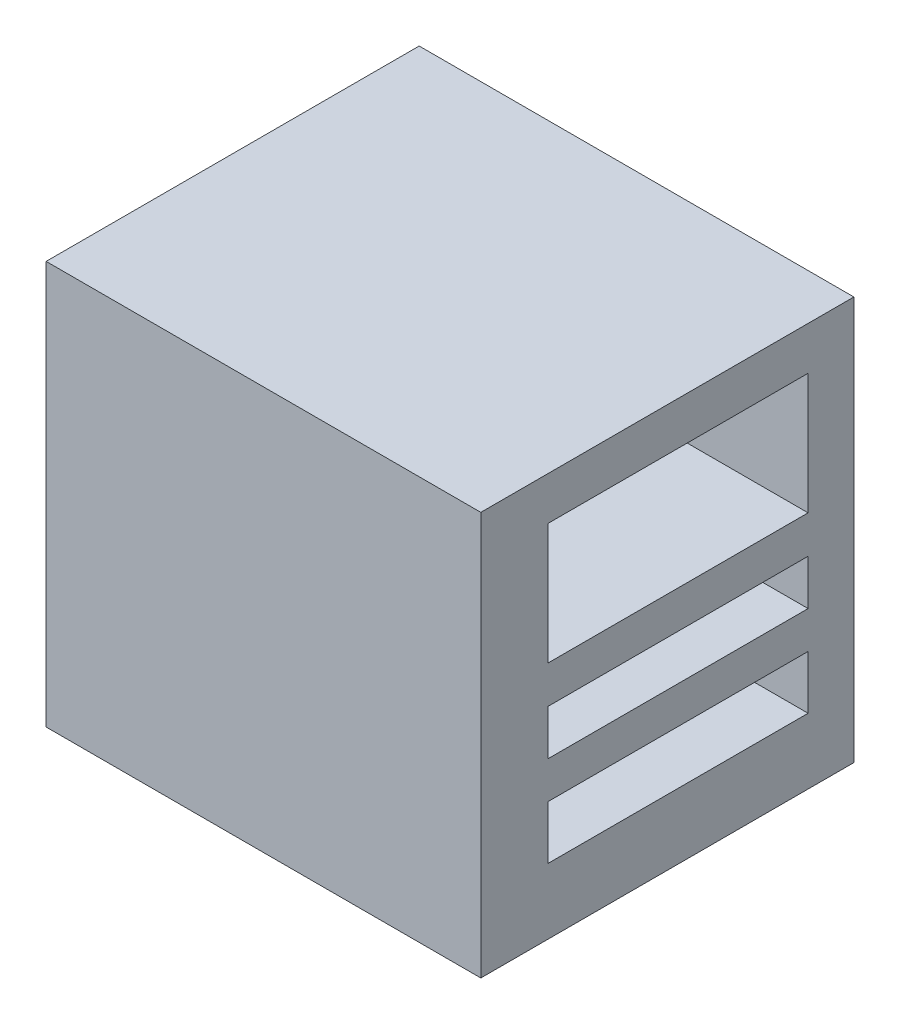
ISO-10303-21;
HEADER;
FILE_DESCRIPTION(('STEP AP214'),'2;1');
FILE_NAME('part.step','',(''),(''),'','','');
FILE_SCHEMA(('AUTOMOTIVE_DESIGN { 1 0 10303 214 1 1 1 1 }'));
ENDSEC;
DATA;
#1=APPLICATION_CONTEXT('core data for automotive mechanical design processes');
#2=APPLICATION_PROTOCOL_DEFINITION('international standard','automotive_design',2000,#1);
#3=PRODUCT_CONTEXT('',#1,'mechanical');
#4=PRODUCT('Part','Part','',(#3));
#5=PRODUCT_RELATED_PRODUCT_CATEGORY('part','',(#4));
#6=PRODUCT_DEFINITION_FORMATION('','',#4);
#7=PRODUCT_DEFINITION_CONTEXT('part definition',#1,'design');
#8=PRODUCT_DEFINITION('design','',#6,#7);
#9=PRODUCT_DEFINITION_SHAPE('','',#8);
#10=(LENGTH_UNIT() NAMED_UNIT(*) SI_UNIT(.MILLI.,.METRE.));
#11=(NAMED_UNIT(*) PLANE_ANGLE_UNIT() SI_UNIT($,.RADIAN.));
#12=(NAMED_UNIT(*) SI_UNIT($,.STERADIAN.) SOLID_ANGLE_UNIT());
#13=UNCERTAINTY_MEASURE_WITH_UNIT(LENGTH_MEASURE(1.E-05),#10,'distance_accuracy_value','');
#14=(GEOMETRIC_REPRESENTATION_CONTEXT(3) GLOBAL_UNCERTAINTY_ASSIGNED_CONTEXT((#13)) GLOBAL_UNIT_ASSIGNED_CONTEXT((#10,
#11,#12)) REPRESENTATION_CONTEXT('',''));
#15=CARTESIAN_POINT('',(0.,0.,0.));
#16=DIRECTION('',(0.,0.,1.));
#17=DIRECTION('',(1.,0.,0.));
#18=AXIS2_PLACEMENT_3D('',#15,#16,#17);
#19=CARTESIAN_POINT('',(100.,0.,0.));
#20=DIRECTION('',(1.,0.,0.));
#21=DIRECTION('',(0.,0.,-1.));
#22=AXIS2_PLACEMENT_3D('',#19,#20,#21);
#23=PLANE('',#22);
#24=DIRECTION('',(0.,-1.,0.));
#25=VECTOR('',#24,1.);
#26=CARTESIAN_POINT('',(100.,35.8571179542807,40.1281874058987));
#27=LINE('',#26,#25);
#28=CARTESIAN_POINT('',(100.,35.8571179542807,40.1281874058987));
#29=VERTEX_POINT('',#28);
#30=CARTESIAN_POINT('',(100.,-56.9144836227226,40.1281874058987));
#31=VERTEX_POINT('',#30);
#32=EDGE_CURVE('E287',#29,#31,#27,.T.);
#33=ORIENTED_EDGE('',*,*,#32,.T.);
#34=DIRECTION('',(0.,0.,-1.));
#35=VECTOR('',#34,1.);
#36=CARTESIAN_POINT('',(100.,-56.9144836227226,40.1281874058987));
#37=LINE('',#36,#35);
#38=CARTESIAN_POINT('',(100.,-56.9144836227226,-45.6905104126569));
#39=VERTEX_POINT('',#38);
#40=EDGE_CURVE('E291',#31,#39,#37,.T.);
#41=ORIENTED_EDGE('',*,*,#40,.T.);
#42=DIRECTION('',(0.,1.,0.));
#43=VECTOR('',#42,1.);
#44=CARTESIAN_POINT('',(100.,35.8571179542807,-45.6905104126569));
#45=LINE('',#44,#43);
#46=CARTESIAN_POINT('',(100.,35.8571179542807,-45.6905104126569));
#47=VERTEX_POINT('',#46);
#48=EDGE_CURVE('E295',#39,#47,#45,.T.);
#49=ORIENTED_EDGE('',*,*,#48,.T.);
#50=DIRECTION('',(0.,0.,1.));
#51=VECTOR('',#50,1.);
#52=CARTESIAN_POINT('',(100.,35.8571179542807,40.1281874058987));
#53=LINE('',#52,#51);
#54=EDGE_CURVE('E298',#47,#29,#53,.T.);
#55=ORIENTED_EDGE('',*,*,#54,.T.);
#56=EDGE_LOOP('',(#33,#41,#49,#55));
#57=FACE_BOUND('',#56,.T.);
#58=DIRECTION('',(0.,0.,-1.));
#59=VECTOR('',#58,1.);
#60=CARTESIAN_POINT('',(100.,-1.88721673443581,24.633144744215));
#61=LINE('',#60,#59);
#62=CARTESIAN_POINT('',(100.,-1.88721673443581,24.633144744215));
#63=VERTEX_POINT('',#62);
#64=CARTESIAN_POINT('',(100.,-1.88721673443581,-35.1618275784359));
#65=VERTEX_POINT('',#64);
#66=EDGE_CURVE('E247',#63,#65,#61,.T.);
#67=ORIENTED_EDGE('',*,*,#66,.F.);
#68=DIRECTION('',(0.,-1.,0.));
#69=VECTOR('',#68,1.);
#70=CARTESIAN_POINT('',(100.,25.9243982993553,24.633144744215));
#71=LINE('',#70,#69);
#72=CARTESIAN_POINT('',(100.,25.9243982993553,24.633144744215));
#73=VERTEX_POINT('',#72);
#74=EDGE_CURVE('E244',#73,#63,#71,.T.);
#75=ORIENTED_EDGE('',*,*,#74,.F.);
#76=DIRECTION('',(0.,0.,1.));
#77=VECTOR('',#76,1.);
#78=CARTESIAN_POINT('',(100.,25.9243982993553,24.633144744215));
#79=LINE('',#78,#77);
#80=CARTESIAN_POINT('',(100.,25.9243982993553,-35.1618275784359));
#81=VERTEX_POINT('',#80);
#82=EDGE_CURVE('E255',#81,#73,#79,.T.);
#83=ORIENTED_EDGE('',*,*,#82,.F.);
#84=DIRECTION('',(0.,1.,0.));
#85=VECTOR('',#84,1.);
#86=CARTESIAN_POINT('',(100.,25.9243982993553,-35.1618275784359));
#87=LINE('',#86,#85);
#88=EDGE_CURVE('E251',#65,#81,#87,.T.);
#89=ORIENTED_EDGE('',*,*,#88,.F.);
#90=EDGE_LOOP('',(#67,#75,#83,#89));
#91=FACE_BOUND('',#90,.T.);
#92=DIRECTION('',(0.,0.,-1.));
#93=VECTOR('',#92,1.);
#94=CARTESIAN_POINT('',(100.,-20.9580384718926,24.633144744215));
#95=LINE('',#94,#93);
#96=CARTESIAN_POINT('',(100.,-20.9580384718926,24.633144744215));
#97=VERTEX_POINT('',#96);
#98=CARTESIAN_POINT('',(100.,-20.9580384718926,-35.1618275784359));
#99=VERTEX_POINT('',#98);
#100=EDGE_CURVE('E204',#97,#99,#95,.T.);
#101=ORIENTED_EDGE('',*,*,#100,.F.);
#102=DIRECTION('',(0.,-1.,0.));
#103=VECTOR('',#102,1.);
#104=CARTESIAN_POINT('',(100.,-10.5286828342209,24.633144744215));
#105=LINE('',#104,#103);
#106=CARTESIAN_POINT('',(100.,-10.5286828342209,24.633144744215));
#107=VERTEX_POINT('',#106);
#108=EDGE_CURVE('E201',#107,#97,#105,.T.);
#109=ORIENTED_EDGE('',*,*,#108,.F.);
#110=DIRECTION('',(0.,0.,1.));
#111=VECTOR('',#110,1.);
#112=CARTESIAN_POINT('',(100.,-10.5286828342209,24.633144744215));
#113=LINE('',#112,#111);
#114=CARTESIAN_POINT('',(100.,-10.5286828342209,-35.1618275784359));
#115=VERTEX_POINT('',#114);
#116=EDGE_CURVE('E212',#115,#107,#113,.T.);
#117=ORIENTED_EDGE('',*,*,#116,.F.);
#118=DIRECTION('',(0.,1.,0.));
#119=VECTOR('',#118,1.);
#120=CARTESIAN_POINT('',(100.,-10.5286828342209,-35.1618275784359));
#121=LINE('',#120,#119);
#122=EDGE_CURVE('E208',#99,#115,#121,.T.);
#123=ORIENTED_EDGE('',*,*,#122,.F.);
#124=EDGE_LOOP('',(#101,#109,#117,#123));
#125=FACE_BOUND('',#124,.T.);
#126=DIRECTION('',(0.,0.,-1.));
#127=VECTOR('',#126,1.);
#128=CARTESIAN_POINT('',(100.,-41.816749747236,24.633144744215));
#129=LINE('',#128,#127);
#130=CARTESIAN_POINT('',(100.,-41.816749747236,24.633144744215));
#131=VERTEX_POINT('',#130);
#132=CARTESIAN_POINT('',(100.,-41.816749747236,-35.1618275784359));
#133=VERTEX_POINT('',#132);
#134=EDGE_CURVE('E162',#131,#133,#129,.T.);
#135=ORIENTED_EDGE('',*,*,#134,.F.);
#136=DIRECTION('',(0.,-1.,0.));
#137=VECTOR('',#136,1.);
#138=CARTESIAN_POINT('',(100.,-29.5001773751284,24.633144744215));
#139=LINE('',#138,#137);
#140=CARTESIAN_POINT('',(100.,-29.5001773751284,24.633144744215));
#141=VERTEX_POINT('',#140);
#142=EDGE_CURVE('E153',#141,#131,#139,.T.);
#143=ORIENTED_EDGE('',*,*,#142,.F.);
#144=DIRECTION('',(0.,0.,1.));
#145=VECTOR('',#144,1.);
#146=CARTESIAN_POINT('',(100.,-29.5001773751284,24.633144744215));
#147=LINE('',#146,#145);
#148=CARTESIAN_POINT('',(100.,-29.5001773751284,-35.1618275784359));
#149=VERTEX_POINT('',#148);
#150=EDGE_CURVE('E179',#149,#141,#147,.T.);
#151=ORIENTED_EDGE('',*,*,#150,.F.);
#152=DIRECTION('',(0.,1.,0.));
#153=VECTOR('',#152,1.);
#154=CARTESIAN_POINT('',(100.,-29.5001773751284,-35.1618275784359));
#155=LINE('',#154,#153);
#156=EDGE_CURVE('E175',#133,#149,#155,.T.);
#157=ORIENTED_EDGE('',*,*,#156,.F.);
#158=EDGE_LOOP('',(#135,#143,#151,#157));
#159=FACE_BOUND('',#158,.T.);
#160=ADVANCED_FACE('F39',(#57,#91,#125,#159),#23,.T.);
#161=CARTESIAN_POINT('',(0.,0.,0.));
#162=DIRECTION('',(1.,0.,0.));
#163=DIRECTION('',(0.,0.,-1.));
#164=AXIS2_PLACEMENT_3D('',#161,#162,#163);
#165=PLANE('',#164);
#166=DIRECTION('',(0.,-1.,0.));
#167=VECTOR('',#166,1.);
#168=CARTESIAN_POINT('',(0.,-10.5286828342209,24.633144744215));
#169=LINE('',#168,#167);
#170=CARTESIAN_POINT('',(0.,-10.5286828342209,24.633144744215));
#171=VERTEX_POINT('',#170);
#172=CARTESIAN_POINT('',(0.,-20.9580384718926,24.633144744215));
#173=VERTEX_POINT('',#172);
#174=EDGE_CURVE('E171',#171,#173,#169,.T.);
#175=ORIENTED_EDGE('',*,*,#174,.T.);
#176=DIRECTION('',(0.,0.,-1.));
#177=VECTOR('',#176,1.);
#178=CARTESIAN_POINT('',(0.,-20.9580384718926,24.633144744215));
#179=LINE('',#178,#177);
#180=CARTESIAN_POINT('',(0.,-20.9580384718926,-35.1618275784359));
#181=VERTEX_POINT('',#180);
#182=EDGE_CURVE('E219',#173,#181,#179,.T.);
#183=ORIENTED_EDGE('',*,*,#182,.T.);
#184=DIRECTION('',(0.,1.,0.));
#185=VECTOR('',#184,1.);
#186=CARTESIAN_POINT('',(0.,-10.5286828342209,-35.1618275784359));
#187=LINE('',#186,#185);
#188=CARTESIAN_POINT('',(0.,-10.5286828342209,-35.1618275784359));
#189=VERTEX_POINT('',#188);
#190=EDGE_CURVE('E223',#181,#189,#187,.T.);
#191=ORIENTED_EDGE('',*,*,#190,.T.);
#192=DIRECTION('',(0.,0.,1.));
#193=VECTOR('',#192,1.);
#194=CARTESIAN_POINT('',(0.,-10.5286828342209,24.633144744215));
#195=LINE('',#194,#193);
#196=EDGE_CURVE('E205',#189,#171,#195,.T.);
#197=ORIENTED_EDGE('',*,*,#196,.T.);
#198=EDGE_LOOP('',(#175,#183,#191,#197));
#199=FACE_BOUND('',#198,.T.);
#200=DIRECTION('',(0.,-1.,0.));
#201=VECTOR('',#200,1.);
#202=CARTESIAN_POINT('',(0.,35.8571179542807,40.1281874058987));
#203=LINE('',#202,#201);
#204=CARTESIAN_POINT('',(0.,35.8571179542807,40.1281874058987));
#205=VERTEX_POINT('',#204);
#206=CARTESIAN_POINT('',(0.,-56.9144836227226,40.1281874058987));
#207=VERTEX_POINT('',#206);
#208=EDGE_CURVE('E286',#205,#207,#203,.T.);
#209=ORIENTED_EDGE('',*,*,#208,.F.);
#210=DIRECTION('',(0.,0.,1.));
#211=VECTOR('',#210,1.);
#212=CARTESIAN_POINT('',(0.,35.8571179542807,40.1281874058987));
#213=LINE('',#212,#211);
#214=CARTESIAN_POINT('',(0.,35.8571179542807,-45.6905104126569));
#215=VERTEX_POINT('',#214);
#216=EDGE_CURVE('E292',#215,#205,#213,.T.);
#217=ORIENTED_EDGE('',*,*,#216,.F.);
#218=DIRECTION('',(0.,1.,0.));
#219=VECTOR('',#218,1.);
#220=CARTESIAN_POINT('',(0.,35.8571179542807,-45.6905104126569));
#221=LINE('',#220,#219);
#222=CARTESIAN_POINT('',(0.,-56.9144836227226,-45.6905104126569));
#223=VERTEX_POINT('',#222);
#224=EDGE_CURVE('E308',#223,#215,#221,.T.);
#225=ORIENTED_EDGE('',*,*,#224,.F.);
#226=DIRECTION('',(0.,0.,-1.));
#227=VECTOR('',#226,1.);
#228=CARTESIAN_POINT('',(0.,-56.9144836227226,40.1281874058987));
#229=LINE('',#228,#227);
#230=EDGE_CURVE('E305',#207,#223,#229,.T.);
#231=ORIENTED_EDGE('',*,*,#230,.F.);
#232=EDGE_LOOP('',(#209,#217,#225,#231));
#233=FACE_BOUND('',#232,.T.);
#234=DIRECTION('',(0.,-1.,0.));
#235=VECTOR('',#234,1.);
#236=CARTESIAN_POINT('',(0.,25.9243982993553,24.633144744215));
#237=LINE('',#236,#235);
#238=CARTESIAN_POINT('',(0.,25.9243982993553,24.633144744215));
#239=VERTEX_POINT('',#238);
#240=CARTESIAN_POINT('',(0.,-1.88721673443581,24.633144744215));
#241=VERTEX_POINT('',#240);
#242=EDGE_CURVE('E243',#239,#241,#237,.T.);
#243=ORIENTED_EDGE('',*,*,#242,.T.);
#244=DIRECTION('',(0.,0.,-1.));
#245=VECTOR('',#244,1.);
#246=CARTESIAN_POINT('',(0.,-1.88721673443581,24.633144744215));
#247=LINE('',#246,#245);
#248=CARTESIAN_POINT('',(0.,-1.88721673443581,-35.1618275784359));
#249=VERTEX_POINT('',#248);
#250=EDGE_CURVE('E262',#241,#249,#247,.T.);
#251=ORIENTED_EDGE('',*,*,#250,.T.);
#252=DIRECTION('',(0.,1.,0.));
#253=VECTOR('',#252,1.);
#254=CARTESIAN_POINT('',(0.,25.9243982993553,-35.1618275784359));
#255=LINE('',#254,#253);
#256=CARTESIAN_POINT('',(0.,25.9243982993553,-35.1618275784359));
#257=VERTEX_POINT('',#256);
#258=EDGE_CURVE('E266',#249,#257,#255,.T.);
#259=ORIENTED_EDGE('',*,*,#258,.T.);
#260=DIRECTION('',(0.,0.,1.));
#261=VECTOR('',#260,1.);
#262=CARTESIAN_POINT('',(0.,25.9243982993553,24.633144744215));
#263=LINE('',#262,#261);
#264=EDGE_CURVE('E248',#257,#239,#263,.T.);
#265=ORIENTED_EDGE('',*,*,#264,.T.);
#266=EDGE_LOOP('',(#243,#251,#259,#265));
#267=FACE_BOUND('',#266,.T.);
#268=DIRECTION('',(0.,-1.,0.));
#269=VECTOR('',#268,1.);
#270=CARTESIAN_POINT('',(0.,-29.5001773751284,24.633144744215));
#271=LINE('',#270,#269);
#272=CARTESIAN_POINT('',(0.,-29.5001773751284,24.633144744215));
#273=VERTEX_POINT('',#272);
#274=CARTESIAN_POINT('',(0.,-41.816749747236,24.633144744215));
#275=VERTEX_POINT('',#274);
#276=EDGE_CURVE('E63',#273,#275,#271,.T.);
#277=ORIENTED_EDGE('',*,*,#276,.T.);
#278=DIRECTION('',(0.,0.,-1.));
#279=VECTOR('',#278,1.);
#280=CARTESIAN_POINT('',(0.,-41.816749747236,24.633144744215));
#281=LINE('',#280,#279);
#282=CARTESIAN_POINT('',(0.,-41.816749747236,-35.1618275784359));
#283=VERTEX_POINT('',#282);
#284=EDGE_CURVE('E169',#275,#283,#281,.T.);
#285=ORIENTED_EDGE('',*,*,#284,.T.);
#286=DIRECTION('',(0.,1.,0.));
#287=VECTOR('',#286,1.);
#288=CARTESIAN_POINT('',(0.,-29.5001773751284,-35.1618275784359));
#289=LINE('',#288,#287);
#290=CARTESIAN_POINT('',(0.,-29.5001773751284,-35.1618275784359));
#291=VERTEX_POINT('',#290);
#292=EDGE_CURVE('E188',#283,#291,#289,.T.);
#293=ORIENTED_EDGE('',*,*,#292,.T.);
#294=DIRECTION('',(0.,0.,1.));
#295=VECTOR('',#294,1.);
#296=CARTESIAN_POINT('',(0.,-29.5001773751284,24.633144744215));
#297=LINE('',#296,#295);
#298=EDGE_CURVE('E163',#291,#273,#297,.T.);
#299=ORIENTED_EDGE('',*,*,#298,.T.);
#300=EDGE_LOOP('',(#277,#285,#293,#299));
#301=FACE_BOUND('',#300,.T.);
#302=ADVANCED_FACE('F331',(#199,#233,#267,#301),#165,.F.);
#303=CARTESIAN_POINT('',(100.,35.8571179542807,40.1281874058987));
#304=DIRECTION('',(0.,0.,-1.));
#305=DIRECTION('',(-1.,0.,0.));
#306=AXIS2_PLACEMENT_3D('',#303,#304,#305);
#307=PLANE('',#306);
#308=ORIENTED_EDGE('',*,*,#208,.T.);
#309=DIRECTION('',(-1.,0.,0.));
#310=VECTOR('',#309,1.);
#311=CARTESIAN_POINT('',(100.,-56.9144836227226,40.1281874058987));
#312=LINE('',#311,#310);
#313=EDGE_CURVE('E11',#31,#207,#312,.T.);
#314=ORIENTED_EDGE('',*,*,#313,.F.);
#315=ORIENTED_EDGE('',*,*,#32,.F.);
#316=DIRECTION('',(-1.,0.,0.));
#317=VECTOR('',#316,1.);
#318=CARTESIAN_POINT('',(100.,35.8571179542807,40.1281874058987));
#319=LINE('',#318,#317);
#320=EDGE_CURVE('E301',#29,#205,#319,.T.);
#321=ORIENTED_EDGE('',*,*,#320,.T.);
#322=EDGE_LOOP('',(#308,#314,#315,#321));
#323=FACE_BOUND('',#322,.T.);
#324=ADVANCED_FACE('F41',(#323),#307,.F.);
#325=CARTESIAN_POINT('',(100.,-56.9144836227226,40.1281874058987));
#326=DIRECTION('',(0.,1.,0.));
#327=DIRECTION('',(0.,0.,1.));
#328=AXIS2_PLACEMENT_3D('',#325,#326,#327);
#329=PLANE('',#328);
#330=ORIENTED_EDGE('',*,*,#230,.T.);
#331=DIRECTION('',(-1.,0.,0.));
#332=VECTOR('',#331,1.);
#333=CARTESIAN_POINT('',(100.,-56.9144836227226,-45.6905104126569));
#334=LINE('',#333,#332);
#335=EDGE_CURVE('E48',#39,#223,#334,.T.);
#336=ORIENTED_EDGE('',*,*,#335,.F.);
#337=ORIENTED_EDGE('',*,*,#40,.F.);
#338=ORIENTED_EDGE('',*,*,#313,.T.);
#339=EDGE_LOOP('',(#330,#336,#337,#338));
#340=FACE_BOUND('',#339,.T.);
#341=ADVANCED_FACE('F342',(#340),#329,.F.);
#342=CARTESIAN_POINT('',(100.,35.8571179542807,-45.6905104126569));
#343=DIRECTION('',(0.,0.,1.));
#344=DIRECTION('',(1.,0.,0.));
#345=AXIS2_PLACEMENT_3D('',#342,#343,#344);
#346=PLANE('',#345);
#347=ORIENTED_EDGE('',*,*,#224,.T.);
#348=DIRECTION('',(-1.,0.,0.));
#349=VECTOR('',#348,1.);
#350=CARTESIAN_POINT('',(100.,35.8571179542807,-45.6905104126569));
#351=LINE('',#350,#349);
#352=EDGE_CURVE('E316',#47,#215,#351,.T.);
#353=ORIENTED_EDGE('',*,*,#352,.F.);
#354=ORIENTED_EDGE('',*,*,#48,.F.);
#355=ORIENTED_EDGE('',*,*,#335,.T.);
#356=EDGE_LOOP('',(#347,#353,#354,#355));
#357=FACE_BOUND('',#356,.T.);
#358=ADVANCED_FACE('F325',(#357),#346,.F.);
#359=CARTESIAN_POINT('',(100.,35.8571179542807,40.1281874058987));
#360=DIRECTION('',(0.,-1.,0.));
#361=DIRECTION('',(0.,0.,-1.));
#362=AXIS2_PLACEMENT_3D('',#359,#360,#361);
#363=PLANE('',#362);
#364=ORIENTED_EDGE('',*,*,#216,.T.);
#365=ORIENTED_EDGE('',*,*,#320,.F.);
#366=ORIENTED_EDGE('',*,*,#54,.F.);
#367=ORIENTED_EDGE('',*,*,#352,.T.);
#368=EDGE_LOOP('',(#364,#365,#366,#367));
#369=FACE_BOUND('',#368,.T.);
#370=ADVANCED_FACE('F335',(#369),#363,.F.);
#371=CARTESIAN_POINT('',(100.,25.9243982993553,24.633144744215));
#372=DIRECTION('',(0.,0.,-1.));
#373=DIRECTION('',(-1.,0.,0.));
#374=AXIS2_PLACEMENT_3D('',#371,#372,#373);
#375=PLANE('',#374);
#376=ORIENTED_EDGE('',*,*,#242,.F.);
#377=DIRECTION('',(-1.,0.,0.));
#378=VECTOR('',#377,1.);
#379=CARTESIAN_POINT('',(100.,25.9243982993553,24.633144744215));
#380=LINE('',#379,#378);
#381=EDGE_CURVE('E258',#73,#239,#380,.T.);
#382=ORIENTED_EDGE('',*,*,#381,.F.);
#383=ORIENTED_EDGE('',*,*,#74,.T.);
#384=DIRECTION('',(-1.,0.,0.));
#385=VECTOR('',#384,1.);
#386=CARTESIAN_POINT('',(100.,-1.88721673443581,24.633144744215));
#387=LINE('',#386,#385);
#388=EDGE_CURVE('E282',#63,#241,#387,.T.);
#389=ORIENTED_EDGE('',*,*,#388,.T.);
#390=EDGE_LOOP('',(#376,#382,#383,#389));
#391=FACE_BOUND('',#390,.T.);
#392=ADVANCED_FACE('F357',(#391),#375,.T.);
#393=CARTESIAN_POINT('',(100.,-1.88721673443581,24.633144744215));
#394=DIRECTION('',(0.,1.,0.));
#395=DIRECTION('',(0.,0.,1.));
#396=AXIS2_PLACEMENT_3D('',#393,#394,#395);
#397=PLANE('',#396);
#398=ORIENTED_EDGE('',*,*,#250,.F.);
#399=ORIENTED_EDGE('',*,*,#388,.F.);
#400=ORIENTED_EDGE('',*,*,#66,.T.);
#401=DIRECTION('',(-1.,0.,0.));
#402=VECTOR('',#401,1.);
#403=CARTESIAN_POINT('',(100.,-1.88721673443581,-35.1618275784359));
#404=LINE('',#403,#402);
#405=EDGE_CURVE('E279',#65,#249,#404,.T.);
#406=ORIENTED_EDGE('',*,*,#405,.T.);
#407=EDGE_LOOP('',(#398,#399,#400,#406));
#408=FACE_BOUND('',#407,.T.);
#409=ADVANCED_FACE('F364',(#408),#397,.T.);
#410=CARTESIAN_POINT('',(100.,25.9243982993553,-35.1618275784359));
#411=DIRECTION('',(0.,0.,1.));
#412=DIRECTION('',(1.,0.,0.));
#413=AXIS2_PLACEMENT_3D('',#410,#411,#412);
#414=PLANE('',#413);
#415=ORIENTED_EDGE('',*,*,#258,.F.);
#416=ORIENTED_EDGE('',*,*,#405,.F.);
#417=ORIENTED_EDGE('',*,*,#88,.T.);
#418=DIRECTION('',(-1.,0.,0.));
#419=VECTOR('',#418,1.);
#420=CARTESIAN_POINT('',(100.,25.9243982993553,-35.1618275784359));
#421=LINE('',#420,#419);
#422=EDGE_CURVE('E276',#81,#257,#421,.T.);
#423=ORIENTED_EDGE('',*,*,#422,.T.);
#424=EDGE_LOOP('',(#415,#416,#417,#423));
#425=FACE_BOUND('',#424,.T.);
#426=ADVANCED_FACE('F369',(#425),#414,.T.);
#427=CARTESIAN_POINT('',(100.,25.9243982993553,24.633144744215));
#428=DIRECTION('',(0.,-1.,0.));
#429=DIRECTION('',(0.,0.,-1.));
#430=AXIS2_PLACEMENT_3D('',#427,#428,#429);
#431=PLANE('',#430);
#432=ORIENTED_EDGE('',*,*,#264,.F.);
#433=ORIENTED_EDGE('',*,*,#422,.F.);
#434=ORIENTED_EDGE('',*,*,#82,.T.);
#435=ORIENTED_EDGE('',*,*,#381,.T.);
#436=EDGE_LOOP('',(#432,#433,#434,#435));
#437=FACE_BOUND('',#436,.T.);
#438=ADVANCED_FACE('F376',(#437),#431,.T.);
#439=CARTESIAN_POINT('',(100.,-10.5286828342209,24.633144744215));
#440=DIRECTION('',(0.,0.,-1.));
#441=DIRECTION('',(-1.,0.,0.));
#442=AXIS2_PLACEMENT_3D('',#439,#440,#441);
#443=PLANE('',#442);
#444=ORIENTED_EDGE('',*,*,#174,.F.);
#445=DIRECTION('',(-1.,0.,0.));
#446=VECTOR('',#445,1.);
#447=CARTESIAN_POINT('',(100.,-10.5286828342209,24.633144744215));
#448=LINE('',#447,#446);
#449=EDGE_CURVE('E215',#107,#171,#448,.T.);
#450=ORIENTED_EDGE('',*,*,#449,.F.);
#451=ORIENTED_EDGE('',*,*,#108,.T.);
#452=DIRECTION('',(-1.,0.,0.));
#453=VECTOR('',#452,1.);
#454=CARTESIAN_POINT('',(100.,-20.9580384718926,24.633144744215));
#455=LINE('',#454,#453);
#456=EDGE_CURVE('E239',#97,#173,#455,.T.);
#457=ORIENTED_EDGE('',*,*,#456,.T.);
#458=EDGE_LOOP('',(#444,#450,#451,#457));
#459=FACE_BOUND('',#458,.T.);
#460=ADVANCED_FACE('F398',(#459),#443,.T.);
#461=CARTESIAN_POINT('',(100.,-20.9580384718926,24.633144744215));
#462=DIRECTION('',(0.,1.,0.));
#463=DIRECTION('',(0.,0.,1.));
#464=AXIS2_PLACEMENT_3D('',#461,#462,#463);
#465=PLANE('',#464);
#466=ORIENTED_EDGE('',*,*,#182,.F.);
#467=ORIENTED_EDGE('',*,*,#456,.F.);
#468=ORIENTED_EDGE('',*,*,#100,.T.);
#469=DIRECTION('',(-1.,0.,0.));
#470=VECTOR('',#469,1.);
#471=CARTESIAN_POINT('',(100.,-20.9580384718926,-35.1618275784359));
#472=LINE('',#471,#470);
#473=EDGE_CURVE('E236',#99,#181,#472,.T.);
#474=ORIENTED_EDGE('',*,*,#473,.T.);
#475=EDGE_LOOP('',(#466,#467,#468,#474));
#476=FACE_BOUND('',#475,.T.);
#477=ADVANCED_FACE('F392',(#476),#465,.T.);
#478=CARTESIAN_POINT('',(100.,-10.5286828342209,-35.1618275784359));
#479=DIRECTION('',(0.,0.,1.));
#480=DIRECTION('',(1.,0.,0.));
#481=AXIS2_PLACEMENT_3D('',#478,#479,#480);
#482=PLANE('',#481);
#483=ORIENTED_EDGE('',*,*,#190,.F.);
#484=ORIENTED_EDGE('',*,*,#473,.F.);
#485=ORIENTED_EDGE('',*,*,#122,.T.);
#486=DIRECTION('',(-1.,0.,0.));
#487=VECTOR('',#486,1.);
#488=CARTESIAN_POINT('',(100.,-10.5286828342209,-35.1618275784359));
#489=LINE('',#488,#487);
#490=EDGE_CURVE('E233',#115,#189,#489,.T.);
#491=ORIENTED_EDGE('',*,*,#490,.T.);
#492=EDGE_LOOP('',(#483,#484,#485,#491));
#493=FACE_BOUND('',#492,.T.);
#494=ADVANCED_FACE('F395',(#493),#482,.T.);
#495=CARTESIAN_POINT('',(100.,-10.5286828342209,24.633144744215));
#496=DIRECTION('',(0.,-1.,0.));
#497=DIRECTION('',(0.,0.,-1.));
#498=AXIS2_PLACEMENT_3D('',#495,#496,#497);
#499=PLANE('',#498);
#500=ORIENTED_EDGE('',*,*,#196,.F.);
#501=ORIENTED_EDGE('',*,*,#490,.F.);
#502=ORIENTED_EDGE('',*,*,#116,.T.);
#503=ORIENTED_EDGE('',*,*,#449,.T.);
#504=EDGE_LOOP('',(#500,#501,#502,#503));
#505=FACE_BOUND('',#504,.T.);
#506=ADVANCED_FACE('F401',(#505),#499,.T.);
#507=CARTESIAN_POINT('',(100.,-29.5001773751284,24.633144744215));
#508=DIRECTION('',(0.,0.,-1.));
#509=DIRECTION('',(-1.,0.,0.));
#510=AXIS2_PLACEMENT_3D('',#507,#508,#509);
#511=PLANE('',#510);
#512=ORIENTED_EDGE('',*,*,#276,.F.);
#513=DIRECTION('',(-1.,0.,0.));
#514=VECTOR('',#513,1.);
#515=CARTESIAN_POINT('',(100.,-29.5001773751284,24.633144744215));
#516=LINE('',#515,#514);
#517=EDGE_CURVE('E157',#141,#273,#516,.T.);
#518=ORIENTED_EDGE('',*,*,#517,.F.);
#519=ORIENTED_EDGE('',*,*,#142,.T.);
#520=DIRECTION('',(-1.,0.,0.));
#521=VECTOR('',#520,1.);
#522=CARTESIAN_POINT('',(100.,-41.816749747236,24.633144744215));
#523=LINE('',#522,#521);
#524=EDGE_CURVE('E156',#131,#275,#523,.T.);
#525=ORIENTED_EDGE('',*,*,#524,.T.);
#526=EDGE_LOOP('',(#512,#518,#519,#525));
#527=FACE_BOUND('',#526,.T.);
#528=ADVANCED_FACE('F155',(#527),#511,.T.);
#529=CARTESIAN_POINT('',(100.,-41.816749747236,24.633144744215));
#530=DIRECTION('',(0.,1.,0.));
#531=DIRECTION('',(0.,0.,1.));
#532=AXIS2_PLACEMENT_3D('',#529,#530,#531);
#533=PLANE('',#532);
#534=ORIENTED_EDGE('',*,*,#284,.F.);
#535=ORIENTED_EDGE('',*,*,#524,.F.);
#536=ORIENTED_EDGE('',*,*,#134,.T.);
#537=DIRECTION('',(-1.,0.,0.));
#538=VECTOR('',#537,1.);
#539=CARTESIAN_POINT('',(100.,-41.816749747236,-35.1618275784359));
#540=LINE('',#539,#538);
#541=EDGE_CURVE('E172',#133,#283,#540,.T.);
#542=ORIENTED_EDGE('',*,*,#541,.T.);
#543=EDGE_LOOP('',(#534,#535,#536,#542));
#544=FACE_BOUND('',#543,.T.);
#545=ADVANCED_FACE('F166',(#544),#533,.T.);
#546=CARTESIAN_POINT('',(100.,-29.5001773751284,-35.1618275784359));
#547=DIRECTION('',(0.,0.,1.));
#548=DIRECTION('',(1.,0.,0.));
#549=AXIS2_PLACEMENT_3D('',#546,#547,#548);
#550=PLANE('',#549);
#551=ORIENTED_EDGE('',*,*,#292,.F.);
#552=ORIENTED_EDGE('',*,*,#541,.F.);
#553=ORIENTED_EDGE('',*,*,#156,.T.);
#554=DIRECTION('',(-1.,0.,0.));
#555=VECTOR('',#554,1.);
#556=CARTESIAN_POINT('',(100.,-29.5001773751284,-35.1618275784359));
#557=LINE('',#556,#555);
#558=EDGE_CURVE('E55',#149,#291,#557,.T.);
#559=ORIENTED_EDGE('',*,*,#558,.T.);
#560=EDGE_LOOP('',(#551,#552,#553,#559));
#561=FACE_BOUND('',#560,.T.);
#562=ADVANCED_FACE('F458',(#561),#550,.T.);
#563=CARTESIAN_POINT('',(100.,-29.5001773751284,24.633144744215));
#564=DIRECTION('',(0.,-1.,0.));
#565=DIRECTION('',(0.,0.,-1.));
#566=AXIS2_PLACEMENT_3D('',#563,#564,#565);
#567=PLANE('',#566);
#568=ORIENTED_EDGE('',*,*,#298,.F.);
#569=ORIENTED_EDGE('',*,*,#558,.F.);
#570=ORIENTED_EDGE('',*,*,#150,.T.);
#571=ORIENTED_EDGE('',*,*,#517,.T.);
#572=EDGE_LOOP('',(#568,#569,#570,#571));
#573=FACE_BOUND('',#572,.T.);
#574=ADVANCED_FACE('F466',(#573),#567,.T.);
#575=CLOSED_SHELL('',(#160,#302,#324,#341,#358,#370,#392,#409,#426,#438,#460,#477,#494,#506,
#528,#545,#562,#574));
#576=MANIFOLD_SOLID_BREP('B2',#575);
#577=ADVANCED_BREP_SHAPE_REPRESENTATION('',(#18,#576),#14);
#578=SHAPE_DEFINITION_REPRESENTATION(#9,#577);
ENDSEC;
END-ISO-10303-21;
